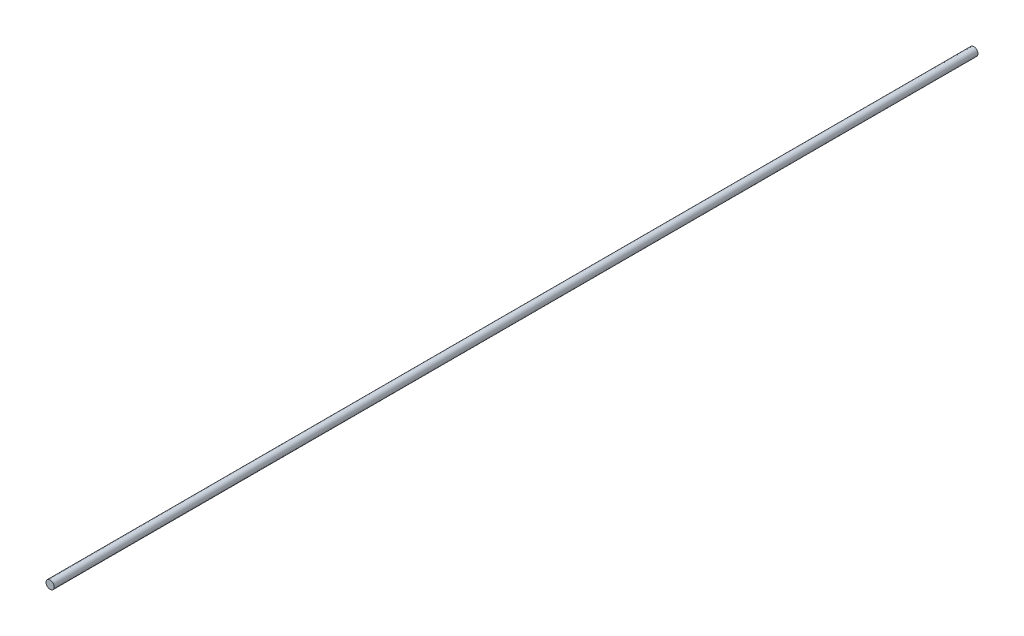
ISO-10303-21;
HEADER;
FILE_DESCRIPTION(('STEP AP214'),'2;1');
FILE_NAME('part.step','',(''),(''),'','','');
FILE_SCHEMA(('AUTOMOTIVE_DESIGN { 1 0 10303 214 1 1 1 1 }'));
ENDSEC;
DATA;
#1=APPLICATION_CONTEXT('core data for automotive mechanical design processes');
#2=APPLICATION_PROTOCOL_DEFINITION('international standard','automotive_design',2000,#1);
#3=PRODUCT_CONTEXT('',#1,'mechanical');
#4=PRODUCT('Part','Part','',(#3));
#5=PRODUCT_RELATED_PRODUCT_CATEGORY('part','',(#4));
#6=PRODUCT_DEFINITION_FORMATION('','',#4);
#7=PRODUCT_DEFINITION_CONTEXT('part definition',#1,'design');
#8=PRODUCT_DEFINITION('design','',#6,#7);
#9=PRODUCT_DEFINITION_SHAPE('','',#8);
#10=(LENGTH_UNIT() NAMED_UNIT(*) SI_UNIT(.MILLI.,.METRE.));
#11=(NAMED_UNIT(*) PLANE_ANGLE_UNIT() SI_UNIT($,.RADIAN.));
#12=(NAMED_UNIT(*) SI_UNIT($,.STERADIAN.) SOLID_ANGLE_UNIT());
#13=UNCERTAINTY_MEASURE_WITH_UNIT(LENGTH_MEASURE(1.E-05),#10,'distance_accuracy_value','');
#14=(GEOMETRIC_REPRESENTATION_CONTEXT(3) GLOBAL_UNCERTAINTY_ASSIGNED_CONTEXT((#13)) GLOBAL_UNIT_ASSIGNED_CONTEXT((#10,
#11,#12)) REPRESENTATION_CONTEXT('',''));
#15=CARTESIAN_POINT('',(0.,0.,0.));
#16=DIRECTION('',(0.,0.,1.));
#17=DIRECTION('',(1.,0.,0.));
#18=AXIS2_PLACEMENT_3D('',#15,#16,#17);
#19=CARTESIAN_POINT('',(0.,0.,900.));
#20=DIRECTION('',(0.,0.,-1.));
#21=DIRECTION('',(-1.,0.,0.));
#22=AXIS2_PLACEMENT_3D('',#19,#20,#21);
#23=CYLINDRICAL_SURFACE('',#22,4.);
#24=CARTESIAN_POINT('',(0.,0.,20.5301616193284));
#25=DIRECTION('',(0.,0.,1.));
#26=DIRECTION('',(1.,0.,0.));
#27=AXIS2_PLACEMENT_3D('',#24,#25,#26);
#28=CIRCLE('',#27,4.);
#29=CARTESIAN_POINT('',(-1.93649167310371,-3.5,20.5301616193283));
#30=VERTEX_POINT('',#29);
#31=CARTESIAN_POINT('',(1.93649167310371,-3.5,20.5301616193284));
#32=VERTEX_POINT('',#31);
#33=EDGE_CURVE('E293',#30,#32,#28,.T.);
#34=ORIENTED_EDGE('',*,*,#33,.T.);
#35=DIRECTION('',(0.,0.,-1.));
#36=VECTOR('',#35,1.);
#37=CARTESIAN_POINT('',(1.93649167310371,-3.5,900.));
#38=LINE('',#37,#36);
#39=CARTESIAN_POINT('',(1.93649167310371,-3.5,3.45840405573401));
#40=VERTEX_POINT('',#39);
#41=EDGE_CURVE('E11',#32,#40,#38,.T.);
#42=ORIENTED_EDGE('',*,*,#41,.T.);
#43=CARTESIAN_POINT('',(0.,0.,3.45840405573405));
#44=DIRECTION('',(0.,0.,-1.));
#45=DIRECTION('',(-1.,0.,0.));
#46=AXIS2_PLACEMENT_3D('',#43,#44,#45);
#47=CIRCLE('',#46,4.);
#48=CARTESIAN_POINT('',(-1.93649167310371,-3.5,3.45840405573401));
#49=VERTEX_POINT('',#48);
#50=EDGE_CURVE('E40',#40,#49,#47,.T.);
#51=ORIENTED_EDGE('',*,*,#50,.T.);
#52=DIRECTION('',(0.,0.,-1.));
#53=VECTOR('',#52,1.);
#54=CARTESIAN_POINT('',(-1.93649167310371,-3.5,900.));
#55=LINE('',#54,#53);
#56=EDGE_CURVE('E290',#49,#30,#55,.F.);
#57=ORIENTED_EDGE('',*,*,#56,.T.);
#58=EDGE_LOOP('',(#34,#42,#51,#57));
#59=FACE_BOUND('',#58,.T.);
#60=CARTESIAN_POINT('',(0.,0.,110.530161619328));
#61=DIRECTION('',(0.,0.,1.));
#62=DIRECTION('',(1.,0.,0.));
#63=AXIS2_PLACEMENT_3D('',#60,#61,#62);
#64=CIRCLE('',#63,4.);
#65=CARTESIAN_POINT('',(-1.93649167310371,-3.5,110.530161619328));
#66=VERTEX_POINT('',#65);
#67=CARTESIAN_POINT('',(1.93649167310371,-3.5,110.530161619328));
#68=VERTEX_POINT('',#67);
#69=EDGE_CURVE('E281',#66,#68,#64,.T.);
#70=ORIENTED_EDGE('',*,*,#69,.T.);
#71=DIRECTION('',(0.,0.,-1.));
#72=VECTOR('',#71,1.);
#73=CARTESIAN_POINT('',(1.93649167310371,-3.5,900.));
#74=LINE('',#73,#72);
#75=CARTESIAN_POINT('',(1.93649167310371,-3.5,93.458404055734));
#76=VERTEX_POINT('',#75);
#77=EDGE_CURVE('E287',#68,#76,#74,.T.);
#78=ORIENTED_EDGE('',*,*,#77,.T.);
#79=CARTESIAN_POINT('',(0.,0.,93.458404055734));
#80=DIRECTION('',(0.,0.,-1.));
#81=DIRECTION('',(-1.,0.,0.));
#82=AXIS2_PLACEMENT_3D('',#79,#80,#81);
#83=CIRCLE('',#82,4.);
#84=CARTESIAN_POINT('',(-1.93649167310371,-3.5,93.458404055734));
#85=VERTEX_POINT('',#84);
#86=EDGE_CURVE('E284',#76,#85,#83,.T.);
#87=ORIENTED_EDGE('',*,*,#86,.T.);
#88=DIRECTION('',(0.,0.,-1.));
#89=VECTOR('',#88,1.);
#90=CARTESIAN_POINT('',(-1.93649167310371,-3.5,900.));
#91=LINE('',#90,#89);
#92=EDGE_CURVE('E278',#85,#66,#91,.F.);
#93=ORIENTED_EDGE('',*,*,#92,.T.);
#94=EDGE_LOOP('',(#70,#78,#87,#93));
#95=FACE_BOUND('',#94,.T.);
#96=CARTESIAN_POINT('',(0.,0.,200.530161619328));
#97=DIRECTION('',(0.,0.,1.));
#98=DIRECTION('',(1.,0.,0.));
#99=AXIS2_PLACEMENT_3D('',#96,#97,#98);
#100=CIRCLE('',#99,4.);
#101=CARTESIAN_POINT('',(-1.93649167310371,-3.5,200.530161619328));
#102=VERTEX_POINT('',#101);
#103=CARTESIAN_POINT('',(1.93649167310371,-3.5,200.530161619328));
#104=VERTEX_POINT('',#103);
#105=EDGE_CURVE('E269',#102,#104,#100,.T.);
#106=ORIENTED_EDGE('',*,*,#105,.T.);
#107=DIRECTION('',(0.,0.,-1.));
#108=VECTOR('',#107,1.);
#109=CARTESIAN_POINT('',(1.93649167310371,-3.5,900.));
#110=LINE('',#109,#108);
#111=CARTESIAN_POINT('',(1.93649167310371,-3.5,183.458404055734));
#112=VERTEX_POINT('',#111);
#113=EDGE_CURVE('E275',#104,#112,#110,.T.);
#114=ORIENTED_EDGE('',*,*,#113,.T.);
#115=CARTESIAN_POINT('',(0.,0.,183.458404055734));
#116=DIRECTION('',(0.,0.,-1.));
#117=DIRECTION('',(-1.,0.,0.));
#118=AXIS2_PLACEMENT_3D('',#115,#116,#117);
#119=CIRCLE('',#118,4.);
#120=CARTESIAN_POINT('',(-1.93649167310371,-3.5,183.458404055734));
#121=VERTEX_POINT('',#120);
#122=EDGE_CURVE('E272',#112,#121,#119,.T.);
#123=ORIENTED_EDGE('',*,*,#122,.T.);
#124=DIRECTION('',(0.,0.,-1.));
#125=VECTOR('',#124,1.);
#126=CARTESIAN_POINT('',(-1.93649167310371,-3.5,900.));
#127=LINE('',#126,#125);
#128=EDGE_CURVE('E266',#121,#102,#127,.F.);
#129=ORIENTED_EDGE('',*,*,#128,.T.);
#130=EDGE_LOOP('',(#106,#114,#123,#129));
#131=FACE_BOUND('',#130,.T.);
#132=CARTESIAN_POINT('',(0.,0.,290.530161619328));
#133=DIRECTION('',(0.,0.,1.));
#134=DIRECTION('',(1.,0.,0.));
#135=AXIS2_PLACEMENT_3D('',#132,#133,#134);
#136=CIRCLE('',#135,4.);
#137=CARTESIAN_POINT('',(-1.93649167310371,-3.5,290.530161619328));
#138=VERTEX_POINT('',#137);
#139=CARTESIAN_POINT('',(1.93649167310371,-3.5,290.530161619328));
#140=VERTEX_POINT('',#139);
#141=EDGE_CURVE('E257',#138,#140,#136,.T.);
#142=ORIENTED_EDGE('',*,*,#141,.T.);
#143=DIRECTION('',(0.,0.,-1.));
#144=VECTOR('',#143,1.);
#145=CARTESIAN_POINT('',(1.93649167310371,-3.5,900.));
#146=LINE('',#145,#144);
#147=CARTESIAN_POINT('',(1.93649167310371,-3.5,273.458404055734));
#148=VERTEX_POINT('',#147);
#149=EDGE_CURVE('E263',#140,#148,#146,.T.);
#150=ORIENTED_EDGE('',*,*,#149,.T.);
#151=CARTESIAN_POINT('',(0.,0.,273.458404055734));
#152=DIRECTION('',(0.,0.,-1.));
#153=DIRECTION('',(-1.,0.,0.));
#154=AXIS2_PLACEMENT_3D('',#151,#152,#153);
#155=CIRCLE('',#154,4.);
#156=CARTESIAN_POINT('',(-1.93649167310371,-3.5,273.458404055734));
#157=VERTEX_POINT('',#156);
#158=EDGE_CURVE('E260',#148,#157,#155,.T.);
#159=ORIENTED_EDGE('',*,*,#158,.T.);
#160=DIRECTION('',(0.,0.,-1.));
#161=VECTOR('',#160,1.);
#162=CARTESIAN_POINT('',(-1.93649167310371,-3.5,900.));
#163=LINE('',#162,#161);
#164=EDGE_CURVE('E254',#157,#138,#163,.F.);
#165=ORIENTED_EDGE('',*,*,#164,.T.);
#166=EDGE_LOOP('',(#142,#150,#159,#165));
#167=FACE_BOUND('',#166,.T.);
#168=CARTESIAN_POINT('',(0.,0.,380.530161619328));
#169=DIRECTION('',(0.,0.,1.));
#170=DIRECTION('',(1.,0.,0.));
#171=AXIS2_PLACEMENT_3D('',#168,#169,#170);
#172=CIRCLE('',#171,4.);
#173=CARTESIAN_POINT('',(-1.93649167310371,-3.5,380.530161619328));
#174=VERTEX_POINT('',#173);
#175=CARTESIAN_POINT('',(1.93649167310371,-3.5,380.530161619328));
#176=VERTEX_POINT('',#175);
#177=EDGE_CURVE('E245',#174,#176,#172,.T.);
#178=ORIENTED_EDGE('',*,*,#177,.T.);
#179=DIRECTION('',(0.,0.,-1.));
#180=VECTOR('',#179,1.);
#181=CARTESIAN_POINT('',(1.93649167310371,-3.5,900.));
#182=LINE('',#181,#180);
#183=CARTESIAN_POINT('',(1.93649167310371,-3.5,363.458404055734));
#184=VERTEX_POINT('',#183);
#185=EDGE_CURVE('E251',#176,#184,#182,.T.);
#186=ORIENTED_EDGE('',*,*,#185,.T.);
#187=CARTESIAN_POINT('',(0.,0.,363.458404055734));
#188=DIRECTION('',(0.,0.,-1.));
#189=DIRECTION('',(-1.,0.,0.));
#190=AXIS2_PLACEMENT_3D('',#187,#188,#189);
#191=CIRCLE('',#190,4.);
#192=CARTESIAN_POINT('',(-1.93649167310371,-3.5,363.458404055734));
#193=VERTEX_POINT('',#192);
#194=EDGE_CURVE('E248',#184,#193,#191,.T.);
#195=ORIENTED_EDGE('',*,*,#194,.T.);
#196=DIRECTION('',(0.,0.,-1.));
#197=VECTOR('',#196,1.);
#198=CARTESIAN_POINT('',(-1.93649167310371,-3.5,900.));
#199=LINE('',#198,#197);
#200=EDGE_CURVE('E242',#193,#174,#199,.F.);
#201=ORIENTED_EDGE('',*,*,#200,.T.);
#202=EDGE_LOOP('',(#178,#186,#195,#201));
#203=FACE_BOUND('',#202,.T.);
#204=CARTESIAN_POINT('',(0.,0.,470.530161619328));
#205=DIRECTION('',(0.,0.,1.));
#206=DIRECTION('',(1.,0.,0.));
#207=AXIS2_PLACEMENT_3D('',#204,#205,#206);
#208=CIRCLE('',#207,4.);
#209=CARTESIAN_POINT('',(-1.93649167310371,-3.5,470.530161619328));
#210=VERTEX_POINT('',#209);
#211=CARTESIAN_POINT('',(1.93649167310371,-3.5,470.530161619328));
#212=VERTEX_POINT('',#211);
#213=EDGE_CURVE('E233',#210,#212,#208,.T.);
#214=ORIENTED_EDGE('',*,*,#213,.T.);
#215=DIRECTION('',(0.,0.,-1.));
#216=VECTOR('',#215,1.);
#217=CARTESIAN_POINT('',(1.93649167310371,-3.5,900.));
#218=LINE('',#217,#216);
#219=CARTESIAN_POINT('',(1.93649167310371,-3.5,453.458404055734));
#220=VERTEX_POINT('',#219);
#221=EDGE_CURVE('E239',#212,#220,#218,.T.);
#222=ORIENTED_EDGE('',*,*,#221,.T.);
#223=CARTESIAN_POINT('',(0.,0.,453.458404055734));
#224=DIRECTION('',(0.,0.,-1.));
#225=DIRECTION('',(-1.,0.,0.));
#226=AXIS2_PLACEMENT_3D('',#223,#224,#225);
#227=CIRCLE('',#226,4.);
#228=CARTESIAN_POINT('',(-1.93649167310371,-3.5,453.458404055734));
#229=VERTEX_POINT('',#228);
#230=EDGE_CURVE('E236',#220,#229,#227,.T.);
#231=ORIENTED_EDGE('',*,*,#230,.T.);
#232=DIRECTION('',(0.,0.,-1.));
#233=VECTOR('',#232,1.);
#234=CARTESIAN_POINT('',(-1.93649167310371,-3.5,900.));
#235=LINE('',#234,#233);
#236=EDGE_CURVE('E230',#229,#210,#235,.F.);
#237=ORIENTED_EDGE('',*,*,#236,.T.);
#238=EDGE_LOOP('',(#214,#222,#231,#237));
#239=FACE_BOUND('',#238,.T.);
#240=CARTESIAN_POINT('',(0.,0.,560.530161619328));
#241=DIRECTION('',(0.,0.,1.));
#242=DIRECTION('',(1.,0.,0.));
#243=AXIS2_PLACEMENT_3D('',#240,#241,#242);
#244=CIRCLE('',#243,4.);
#245=CARTESIAN_POINT('',(-1.93649167310371,-3.5,560.530161619328));
#246=VERTEX_POINT('',#245);
#247=CARTESIAN_POINT('',(1.93649167310371,-3.5,560.530161619328));
#248=VERTEX_POINT('',#247);
#249=EDGE_CURVE('E221',#246,#248,#244,.T.);
#250=ORIENTED_EDGE('',*,*,#249,.T.);
#251=DIRECTION('',(0.,0.,-1.));
#252=VECTOR('',#251,1.);
#253=CARTESIAN_POINT('',(1.93649167310371,-3.5,900.));
#254=LINE('',#253,#252);
#255=CARTESIAN_POINT('',(1.93649167310371,-3.5,543.458404055734));
#256=VERTEX_POINT('',#255);
#257=EDGE_CURVE('E227',#248,#256,#254,.T.);
#258=ORIENTED_EDGE('',*,*,#257,.T.);
#259=CARTESIAN_POINT('',(0.,0.,543.458404055734));
#260=DIRECTION('',(0.,0.,-1.));
#261=DIRECTION('',(-1.,0.,0.));
#262=AXIS2_PLACEMENT_3D('',#259,#260,#261);
#263=CIRCLE('',#262,4.);
#264=CARTESIAN_POINT('',(-1.93649167310371,-3.5,543.458404055734));
#265=VERTEX_POINT('',#264);
#266=EDGE_CURVE('E224',#256,#265,#263,.T.);
#267=ORIENTED_EDGE('',*,*,#266,.T.);
#268=DIRECTION('',(0.,0.,-1.));
#269=VECTOR('',#268,1.);
#270=CARTESIAN_POINT('',(-1.93649167310371,-3.5,900.));
#271=LINE('',#270,#269);
#272=EDGE_CURVE('E218',#265,#246,#271,.F.);
#273=ORIENTED_EDGE('',*,*,#272,.T.);
#274=EDGE_LOOP('',(#250,#258,#267,#273));
#275=FACE_BOUND('',#274,.T.);
#276=CARTESIAN_POINT('',(0.,0.,650.530161619328));
#277=DIRECTION('',(0.,0.,1.));
#278=DIRECTION('',(1.,0.,0.));
#279=AXIS2_PLACEMENT_3D('',#276,#277,#278);
#280=CIRCLE('',#279,4.);
#281=CARTESIAN_POINT('',(-1.93649167310371,-3.5,650.530161619328));
#282=VERTEX_POINT('',#281);
#283=CARTESIAN_POINT('',(1.93649167310371,-3.5,650.530161619328));
#284=VERTEX_POINT('',#283);
#285=EDGE_CURVE('E209',#282,#284,#280,.T.);
#286=ORIENTED_EDGE('',*,*,#285,.T.);
#287=DIRECTION('',(0.,0.,-1.));
#288=VECTOR('',#287,1.);
#289=CARTESIAN_POINT('',(1.93649167310371,-3.5,900.));
#290=LINE('',#289,#288);
#291=CARTESIAN_POINT('',(1.93649167310371,-3.5,633.458404055734));
#292=VERTEX_POINT('',#291);
#293=EDGE_CURVE('E215',#284,#292,#290,.T.);
#294=ORIENTED_EDGE('',*,*,#293,.T.);
#295=CARTESIAN_POINT('',(0.,0.,633.458404055734));
#296=DIRECTION('',(0.,0.,-1.));
#297=DIRECTION('',(-1.,0.,0.));
#298=AXIS2_PLACEMENT_3D('',#295,#296,#297);
#299=CIRCLE('',#298,4.);
#300=CARTESIAN_POINT('',(-1.93649167310371,-3.5,633.458404055734));
#301=VERTEX_POINT('',#300);
#302=EDGE_CURVE('E212',#292,#301,#299,.T.);
#303=ORIENTED_EDGE('',*,*,#302,.T.);
#304=DIRECTION('',(0.,0.,-1.));
#305=VECTOR('',#304,1.);
#306=CARTESIAN_POINT('',(-1.93649167310371,-3.5,900.));
#307=LINE('',#306,#305);
#308=EDGE_CURVE('E206',#301,#282,#307,.F.);
#309=ORIENTED_EDGE('',*,*,#308,.T.);
#310=EDGE_LOOP('',(#286,#294,#303,#309));
#311=FACE_BOUND('',#310,.T.);
#312=CARTESIAN_POINT('',(0.,0.,740.530161619328));
#313=DIRECTION('',(0.,0.,1.));
#314=DIRECTION('',(1.,0.,0.));
#315=AXIS2_PLACEMENT_3D('',#312,#313,#314);
#316=CIRCLE('',#315,4.);
#317=CARTESIAN_POINT('',(-1.93649167310371,-3.5,740.530161619328));
#318=VERTEX_POINT('',#317);
#319=CARTESIAN_POINT('',(1.93649167310371,-3.5,740.530161619328));
#320=VERTEX_POINT('',#319);
#321=EDGE_CURVE('E197',#318,#320,#316,.T.);
#322=ORIENTED_EDGE('',*,*,#321,.T.);
#323=DIRECTION('',(0.,0.,-1.));
#324=VECTOR('',#323,1.);
#325=CARTESIAN_POINT('',(1.93649167310371,-3.5,900.));
#326=LINE('',#325,#324);
#327=CARTESIAN_POINT('',(1.93649167310371,-3.5,723.458404055734));
#328=VERTEX_POINT('',#327);
#329=EDGE_CURVE('E203',#320,#328,#326,.T.);
#330=ORIENTED_EDGE('',*,*,#329,.T.);
#331=CARTESIAN_POINT('',(0.,0.,723.458404055734));
#332=DIRECTION('',(0.,0.,-1.));
#333=DIRECTION('',(-1.,0.,0.));
#334=AXIS2_PLACEMENT_3D('',#331,#332,#333);
#335=CIRCLE('',#334,4.);
#336=CARTESIAN_POINT('',(-1.93649167310371,-3.5,723.458404055734));
#337=VERTEX_POINT('',#336);
#338=EDGE_CURVE('E200',#328,#337,#335,.T.);
#339=ORIENTED_EDGE('',*,*,#338,.T.);
#340=DIRECTION('',(0.,0.,-1.));
#341=VECTOR('',#340,1.);
#342=CARTESIAN_POINT('',(-1.93649167310371,-3.5,900.));
#343=LINE('',#342,#341);
#344=EDGE_CURVE('E179',#337,#318,#343,.F.);
#345=ORIENTED_EDGE('',*,*,#344,.T.);
#346=EDGE_LOOP('',(#322,#330,#339,#345));
#347=FACE_BOUND('',#346,.T.);
#348=CARTESIAN_POINT('',(0.,0.,830.530161619328));
#349=DIRECTION('',(0.,0.,1.));
#350=DIRECTION('',(1.,0.,0.));
#351=AXIS2_PLACEMENT_3D('',#348,#349,#350);
#352=CIRCLE('',#351,4.);
#353=CARTESIAN_POINT('',(-1.93649167310371,-3.5,830.530161619328));
#354=VERTEX_POINT('',#353);
#355=CARTESIAN_POINT('',(1.93649167310371,-3.5,830.530161619328));
#356=VERTEX_POINT('',#355);
#357=EDGE_CURVE('E184',#354,#356,#352,.T.);
#358=ORIENTED_EDGE('',*,*,#357,.T.);
#359=DIRECTION('',(0.,0.,-1.));
#360=VECTOR('',#359,1.);
#361=CARTESIAN_POINT('',(1.93649167310371,-3.5,900.));
#362=LINE('',#361,#360);
#363=CARTESIAN_POINT('',(1.93649167310371,-3.5,813.458404055734));
#364=VERTEX_POINT('',#363);
#365=EDGE_CURVE('E169',#356,#364,#362,.T.);
#366=ORIENTED_EDGE('',*,*,#365,.T.);
#367=CARTESIAN_POINT('',(0.,0.,813.458404055734));
#368=DIRECTION('',(0.,0.,-1.));
#369=DIRECTION('',(-1.,0.,0.));
#370=AXIS2_PLACEMENT_3D('',#367,#368,#369);
#371=CIRCLE('',#370,4.);
#372=CARTESIAN_POINT('',(-1.93649167310371,-3.5,813.458404055734));
#373=VERTEX_POINT('',#372);
#374=EDGE_CURVE('E180',#364,#373,#371,.T.);
#375=ORIENTED_EDGE('',*,*,#374,.T.);
#376=DIRECTION('',(0.,0.,-1.));
#377=VECTOR('',#376,1.);
#378=CARTESIAN_POINT('',(-1.93649167310371,-3.5,900.));
#379=LINE('',#378,#377);
#380=EDGE_CURVE('E188',#373,#354,#379,.F.);
#381=ORIENTED_EDGE('',*,*,#380,.T.);
#382=EDGE_LOOP('',(#358,#366,#375,#381));
#383=FACE_BOUND('',#382,.T.);
#384=CARTESIAN_POINT('',(0.,0.,900.));
#385=DIRECTION('',(0.,0.,1.));
#386=DIRECTION('',(1.,0.,0.));
#387=AXIS2_PLACEMENT_3D('',#384,#385,#386);
#388=CIRCLE('',#387,4.);
#389=CARTESIAN_POINT('',(4.,0.,900.));
#390=VERTEX_POINT('',#389);
#391=EDGE_CURVE('E191',#390,#390,#388,.T.);
#392=ORIENTED_EDGE('',*,*,#391,.F.);
#393=EDGE_LOOP('',(#392));
#394=FACE_BOUND('',#393,.T.);
#395=CARTESIAN_POINT('',(0.,0.,0.));
#396=DIRECTION('',(0.,0.,1.));
#397=DIRECTION('',(1.,0.,0.));
#398=AXIS2_PLACEMENT_3D('',#395,#396,#397);
#399=CIRCLE('',#398,4.);
#400=CARTESIAN_POINT('',(4.,0.,0.));
#401=VERTEX_POINT('',#400);
#402=EDGE_CURVE('E304',#401,#401,#399,.T.);
#403=ORIENTED_EDGE('',*,*,#402,.T.);
#404=EDGE_LOOP('',(#403));
#405=FACE_BOUND('',#404,.T.);
#406=ADVANCED_FACE('F33',(#59,#95,#131,#167,#203,#239,#275,#311,#347,#383,#394,#405),#23,.T.);
#407=CARTESIAN_POINT('',(0.,0.,900.));
#408=DIRECTION('',(0.,0.,1.));
#409=DIRECTION('',(1.,0.,0.));
#410=AXIS2_PLACEMENT_3D('',#407,#408,#409);
#411=PLANE('',#410);
#412=ORIENTED_EDGE('',*,*,#391,.T.);
#413=EDGE_LOOP('',(#412));
#414=FACE_BOUND('',#413,.T.);
#415=ADVANCED_FACE('F359',(#414),#411,.T.);
#416=CARTESIAN_POINT('',(0.,0.,0.));
#417=DIRECTION('',(0.,0.,1.));
#418=DIRECTION('',(1.,0.,0.));
#419=AXIS2_PLACEMENT_3D('',#416,#417,#418);
#420=PLANE('',#419);
#421=ORIENTED_EDGE('',*,*,#402,.F.);
#422=EDGE_LOOP('',(#421));
#423=FACE_BOUND('',#422,.T.);
#424=ADVANCED_FACE('F364',(#423),#420,.F.);
#425=CARTESIAN_POINT('',(-2.71325807098481,-13.5,813.458404055734));
#426=DIRECTION('',(0.,0.,-1.));
#427=DIRECTION('',(-1.,0.,0.));
#428=AXIS2_PLACEMENT_3D('',#425,#426,#427);
#429=PLANE('',#428);
#430=DIRECTION('',(-1.,0.,0.));
#431=VECTOR('',#430,1.);
#432=CARTESIAN_POINT('',(-2.71325807098481,-3.5,813.458404055734));
#433=LINE('',#432,#431);
#434=EDGE_CURVE('E175',#364,#373,#433,.T.);
#435=ORIENTED_EDGE('',*,*,#434,.T.);
#436=ORIENTED_EDGE('',*,*,#374,.F.);
#437=EDGE_LOOP('',(#435,#436));
#438=FACE_BOUND('',#437,.T.);
#439=ADVANCED_FACE('F366',(#438),#429,.F.);
#440=CARTESIAN_POINT('',(-2.71325807098481,-13.5,830.530161619328));
#441=DIRECTION('',(0.,0.,1.));
#442=DIRECTION('',(1.,0.,0.));
#443=AXIS2_PLACEMENT_3D('',#440,#441,#442);
#444=PLANE('',#443);
#445=DIRECTION('',(1.,0.,0.));
#446=VECTOR('',#445,1.);
#447=CARTESIAN_POINT('',(-2.71325807098481,-3.5,830.530161619328));
#448=LINE('',#447,#446);
#449=EDGE_CURVE('E172',#354,#356,#448,.T.);
#450=ORIENTED_EDGE('',*,*,#449,.T.);
#451=ORIENTED_EDGE('',*,*,#357,.F.);
#452=EDGE_LOOP('',(#450,#451));
#453=FACE_BOUND('',#452,.T.);
#454=ADVANCED_FACE('F183',(#453),#444,.F.);
#455=CARTESIAN_POINT('',(0.,-3.5,0.));
#456=DIRECTION('',(0.,1.,0.));
#457=DIRECTION('',(0.,0.,1.));
#458=AXIS2_PLACEMENT_3D('',#455,#456,#457);
#459=PLANE('',#458);
#460=ORIENTED_EDGE('',*,*,#449,.F.);
#461=ORIENTED_EDGE('',*,*,#380,.F.);
#462=ORIENTED_EDGE('',*,*,#434,.F.);
#463=ORIENTED_EDGE('',*,*,#365,.F.);
#464=EDGE_LOOP('',(#460,#461,#462,#463));
#465=FACE_BOUND('',#464,.T.);
#466=ADVANCED_FACE('F171',(#465),#459,.F.);
#467=CARTESIAN_POINT('',(-2.71325807098575,-13.5,723.458404055734));
#468=DIRECTION('',(0.,0.,-1.));
#469=DIRECTION('',(-1.,0.,0.));
#470=AXIS2_PLACEMENT_3D('',#467,#468,#469);
#471=PLANE('',#470);
#472=DIRECTION('',(-1.,0.,0.));
#473=VECTOR('',#472,1.);
#474=CARTESIAN_POINT('',(-2.71325807098575,-3.5,723.458404055734));
#475=LINE('',#474,#473);
#476=EDGE_CURVE('E347',#328,#337,#475,.T.);
#477=ORIENTED_EDGE('',*,*,#476,.T.);
#478=ORIENTED_EDGE('',*,*,#338,.F.);
#479=EDGE_LOOP('',(#477,#478));
#480=FACE_BOUND('',#479,.T.);
#481=ADVANCED_FACE('F379',(#480),#471,.F.);
#482=CARTESIAN_POINT('',(-2.71325807098575,-13.5,740.530161619328));
#483=DIRECTION('',(0.,0.,1.));
#484=DIRECTION('',(1.,0.,0.));
#485=AXIS2_PLACEMENT_3D('',#482,#483,#484);
#486=PLANE('',#485);
#487=DIRECTION('',(1.,0.,0.));
#488=VECTOR('',#487,1.);
#489=CARTESIAN_POINT('',(-2.71325807098575,-3.5,740.530161619328));
#490=LINE('',#489,#488);
#491=EDGE_CURVE('E350',#318,#320,#490,.T.);
#492=ORIENTED_EDGE('',*,*,#491,.T.);
#493=ORIENTED_EDGE('',*,*,#321,.F.);
#494=EDGE_LOOP('',(#492,#493));
#495=FACE_BOUND('',#494,.T.);
#496=ADVANCED_FACE('F380',(#495),#486,.F.);
#497=CARTESIAN_POINT('',(0.,-3.5,0.));
#498=DIRECTION('',(0.,1.,0.));
#499=DIRECTION('',(0.,0.,1.));
#500=AXIS2_PLACEMENT_3D('',#497,#498,#499);
#501=PLANE('',#500);
#502=ORIENTED_EDGE('',*,*,#491,.F.);
#503=ORIENTED_EDGE('',*,*,#344,.F.);
#504=ORIENTED_EDGE('',*,*,#476,.F.);
#505=ORIENTED_EDGE('',*,*,#329,.F.);
#506=EDGE_LOOP('',(#502,#503,#504,#505));
#507=FACE_BOUND('',#506,.T.);
#508=ADVANCED_FACE('F383',(#507),#501,.F.);
#509=CARTESIAN_POINT('',(-2.71325807098669,-13.5,633.458404055734));
#510=DIRECTION('',(0.,0.,-1.));
#511=DIRECTION('',(-1.,0.,0.));
#512=AXIS2_PLACEMENT_3D('',#509,#510,#511);
#513=PLANE('',#512);
#514=DIRECTION('',(-1.,0.,0.));
#515=VECTOR('',#514,1.);
#516=CARTESIAN_POINT('',(-2.71325807098669,-3.5,633.458404055734));
#517=LINE('',#516,#515);
#518=EDGE_CURVE('E341',#292,#301,#517,.T.);
#519=ORIENTED_EDGE('',*,*,#518,.T.);
#520=ORIENTED_EDGE('',*,*,#302,.F.);
#521=EDGE_LOOP('',(#519,#520));
#522=FACE_BOUND('',#521,.T.);
#523=ADVANCED_FACE('F390',(#522),#513,.F.);
#524=CARTESIAN_POINT('',(-2.71325807098669,-13.5,650.530161619328));
#525=DIRECTION('',(0.,0.,1.));
#526=DIRECTION('',(1.,0.,0.));
#527=AXIS2_PLACEMENT_3D('',#524,#525,#526);
#528=PLANE('',#527);
#529=DIRECTION('',(1.,0.,0.));
#530=VECTOR('',#529,1.);
#531=CARTESIAN_POINT('',(-2.71325807098669,-3.5,650.530161619328));
#532=LINE('',#531,#530);
#533=EDGE_CURVE('E344',#282,#284,#532,.T.);
#534=ORIENTED_EDGE('',*,*,#533,.T.);
#535=ORIENTED_EDGE('',*,*,#285,.F.);
#536=EDGE_LOOP('',(#534,#535));
#537=FACE_BOUND('',#536,.T.);
#538=ADVANCED_FACE('F392',(#537),#528,.F.);
#539=CARTESIAN_POINT('',(0.,-3.5,0.));
#540=DIRECTION('',(0.,1.,0.));
#541=DIRECTION('',(0.,0.,1.));
#542=AXIS2_PLACEMENT_3D('',#539,#540,#541);
#543=PLANE('',#542);
#544=ORIENTED_EDGE('',*,*,#533,.F.);
#545=ORIENTED_EDGE('',*,*,#308,.F.);
#546=ORIENTED_EDGE('',*,*,#518,.F.);
#547=ORIENTED_EDGE('',*,*,#293,.F.);
#548=EDGE_LOOP('',(#544,#545,#546,#547));
#549=FACE_BOUND('',#548,.T.);
#550=ADVANCED_FACE('F395',(#549),#543,.F.);
#551=CARTESIAN_POINT('',(-2.71325807098763,-13.5,543.458404055734));
#552=DIRECTION('',(0.,0.,-1.));
#553=DIRECTION('',(-1.,0.,0.));
#554=AXIS2_PLACEMENT_3D('',#551,#552,#553);
#555=PLANE('',#554);
#556=DIRECTION('',(-1.,0.,0.));
#557=VECTOR('',#556,1.);
#558=CARTESIAN_POINT('',(-2.71325807098763,-3.5,543.458404055734));
#559=LINE('',#558,#557);
#560=EDGE_CURVE('E335',#256,#265,#559,.T.);
#561=ORIENTED_EDGE('',*,*,#560,.T.);
#562=ORIENTED_EDGE('',*,*,#266,.F.);
#563=EDGE_LOOP('',(#561,#562));
#564=FACE_BOUND('',#563,.T.);
#565=ADVANCED_FACE('F402',(#564),#555,.F.);
#566=CARTESIAN_POINT('',(-2.71325807098763,-13.5,560.530161619328));
#567=DIRECTION('',(0.,0.,1.));
#568=DIRECTION('',(1.,0.,0.));
#569=AXIS2_PLACEMENT_3D('',#566,#567,#568);
#570=PLANE('',#569);
#571=DIRECTION('',(1.,0.,0.));
#572=VECTOR('',#571,1.);
#573=CARTESIAN_POINT('',(-2.71325807098763,-3.5,560.530161619328));
#574=LINE('',#573,#572);
#575=EDGE_CURVE('E338',#246,#248,#574,.T.);
#576=ORIENTED_EDGE('',*,*,#575,.T.);
#577=ORIENTED_EDGE('',*,*,#249,.F.);
#578=EDGE_LOOP('',(#576,#577));
#579=FACE_BOUND('',#578,.T.);
#580=ADVANCED_FACE('F404',(#579),#570,.F.);
#581=CARTESIAN_POINT('',(0.,-3.5,0.));
#582=DIRECTION('',(0.,1.,0.));
#583=DIRECTION('',(0.,0.,1.));
#584=AXIS2_PLACEMENT_3D('',#581,#582,#583);
#585=PLANE('',#584);
#586=ORIENTED_EDGE('',*,*,#575,.F.);
#587=ORIENTED_EDGE('',*,*,#272,.F.);
#588=ORIENTED_EDGE('',*,*,#560,.F.);
#589=ORIENTED_EDGE('',*,*,#257,.F.);
#590=EDGE_LOOP('',(#586,#587,#588,#589));
#591=FACE_BOUND('',#590,.T.);
#592=ADVANCED_FACE('F407',(#591),#585,.F.);
#593=CARTESIAN_POINT('',(-2.71325807098858,-13.5,453.458404055734));
#594=DIRECTION('',(0.,0.,-1.));
#595=DIRECTION('',(-1.,0.,0.));
#596=AXIS2_PLACEMENT_3D('',#593,#594,#595);
#597=PLANE('',#596);
#598=DIRECTION('',(-1.,0.,0.));
#599=VECTOR('',#598,1.);
#600=CARTESIAN_POINT('',(-2.71325807098858,-3.5,453.458404055734));
#601=LINE('',#600,#599);
#602=EDGE_CURVE('E329',#220,#229,#601,.T.);
#603=ORIENTED_EDGE('',*,*,#602,.T.);
#604=ORIENTED_EDGE('',*,*,#230,.F.);
#605=EDGE_LOOP('',(#603,#604));
#606=FACE_BOUND('',#605,.T.);
#607=ADVANCED_FACE('F414',(#606),#597,.F.);
#608=CARTESIAN_POINT('',(-2.71325807098858,-13.5,470.530161619328));
#609=DIRECTION('',(0.,0.,1.));
#610=DIRECTION('',(1.,0.,0.));
#611=AXIS2_PLACEMENT_3D('',#608,#609,#610);
#612=PLANE('',#611);
#613=DIRECTION('',(1.,0.,0.));
#614=VECTOR('',#613,1.);
#615=CARTESIAN_POINT('',(-2.71325807098858,-3.5,470.530161619328));
#616=LINE('',#615,#614);
#617=EDGE_CURVE('E332',#210,#212,#616,.T.);
#618=ORIENTED_EDGE('',*,*,#617,.T.);
#619=ORIENTED_EDGE('',*,*,#213,.F.);
#620=EDGE_LOOP('',(#618,#619));
#621=FACE_BOUND('',#620,.T.);
#622=ADVANCED_FACE('F416',(#621),#612,.F.);
#623=CARTESIAN_POINT('',(0.,-3.5,0.));
#624=DIRECTION('',(0.,1.,0.));
#625=DIRECTION('',(0.,0.,1.));
#626=AXIS2_PLACEMENT_3D('',#623,#624,#625);
#627=PLANE('',#626);
#628=ORIENTED_EDGE('',*,*,#617,.F.);
#629=ORIENTED_EDGE('',*,*,#236,.F.);
#630=ORIENTED_EDGE('',*,*,#602,.F.);
#631=ORIENTED_EDGE('',*,*,#221,.F.);
#632=EDGE_LOOP('',(#628,#629,#630,#631));
#633=FACE_BOUND('',#632,.T.);
#634=ADVANCED_FACE('F419',(#633),#627,.F.);
#635=CARTESIAN_POINT('',(-2.71325807098952,-13.5,363.458404055734));
#636=DIRECTION('',(0.,0.,-1.));
#637=DIRECTION('',(-1.,0.,0.));
#638=AXIS2_PLACEMENT_3D('',#635,#636,#637);
#639=PLANE('',#638);
#640=DIRECTION('',(-1.,0.,0.));
#641=VECTOR('',#640,1.);
#642=CARTESIAN_POINT('',(-2.71325807098952,-3.5,363.458404055734));
#643=LINE('',#642,#641);
#644=EDGE_CURVE('E323',#184,#193,#643,.T.);
#645=ORIENTED_EDGE('',*,*,#644,.T.);
#646=ORIENTED_EDGE('',*,*,#194,.F.);
#647=EDGE_LOOP('',(#645,#646));
#648=FACE_BOUND('',#647,.T.);
#649=ADVANCED_FACE('F426',(#648),#639,.F.);
#650=CARTESIAN_POINT('',(-2.71325807098952,-13.5,380.530161619328));
#651=DIRECTION('',(0.,0.,1.));
#652=DIRECTION('',(1.,0.,0.));
#653=AXIS2_PLACEMENT_3D('',#650,#651,#652);
#654=PLANE('',#653);
#655=DIRECTION('',(1.,0.,0.));
#656=VECTOR('',#655,1.);
#657=CARTESIAN_POINT('',(-2.71325807098952,-3.5,380.530161619328));
#658=LINE('',#657,#656);
#659=EDGE_CURVE('E326',#174,#176,#658,.T.);
#660=ORIENTED_EDGE('',*,*,#659,.T.);
#661=ORIENTED_EDGE('',*,*,#177,.F.);
#662=EDGE_LOOP('',(#660,#661));
#663=FACE_BOUND('',#662,.T.);
#664=ADVANCED_FACE('F428',(#663),#654,.F.);
#665=CARTESIAN_POINT('',(0.,-3.5,0.));
#666=DIRECTION('',(0.,1.,0.));
#667=DIRECTION('',(0.,0.,1.));
#668=AXIS2_PLACEMENT_3D('',#665,#666,#667);
#669=PLANE('',#668);
#670=ORIENTED_EDGE('',*,*,#659,.F.);
#671=ORIENTED_EDGE('',*,*,#200,.F.);
#672=ORIENTED_EDGE('',*,*,#644,.F.);
#673=ORIENTED_EDGE('',*,*,#185,.F.);
#674=EDGE_LOOP('',(#670,#671,#672,#673));
#675=FACE_BOUND('',#674,.T.);
#676=ADVANCED_FACE('F431',(#675),#669,.F.);
#677=CARTESIAN_POINT('',(-2.71325807099046,-13.5,273.458404055734));
#678=DIRECTION('',(0.,0.,-1.));
#679=DIRECTION('',(-1.,0.,0.));
#680=AXIS2_PLACEMENT_3D('',#677,#678,#679);
#681=PLANE('',#680);
#682=DIRECTION('',(-1.,0.,0.));
#683=VECTOR('',#682,1.);
#684=CARTESIAN_POINT('',(-2.71325807099046,-3.5,273.458404055734));
#685=LINE('',#684,#683);
#686=EDGE_CURVE('E317',#148,#157,#685,.T.);
#687=ORIENTED_EDGE('',*,*,#686,.T.);
#688=ORIENTED_EDGE('',*,*,#158,.F.);
#689=EDGE_LOOP('',(#687,#688));
#690=FACE_BOUND('',#689,.T.);
#691=ADVANCED_FACE('F438',(#690),#681,.F.);
#692=CARTESIAN_POINT('',(-2.71325807099046,-13.5,290.530161619328));
#693=DIRECTION('',(0.,0.,1.));
#694=DIRECTION('',(1.,0.,0.));
#695=AXIS2_PLACEMENT_3D('',#692,#693,#694);
#696=PLANE('',#695);
#697=DIRECTION('',(1.,0.,0.));
#698=VECTOR('',#697,1.);
#699=CARTESIAN_POINT('',(-2.71325807099046,-3.5,290.530161619328));
#700=LINE('',#699,#698);
#701=EDGE_CURVE('E320',#138,#140,#700,.T.);
#702=ORIENTED_EDGE('',*,*,#701,.T.);
#703=ORIENTED_EDGE('',*,*,#141,.F.);
#704=EDGE_LOOP('',(#702,#703));
#705=FACE_BOUND('',#704,.T.);
#706=ADVANCED_FACE('F440',(#705),#696,.F.);
#707=CARTESIAN_POINT('',(0.,-3.5,0.));
#708=DIRECTION('',(0.,1.,0.));
#709=DIRECTION('',(0.,0.,1.));
#710=AXIS2_PLACEMENT_3D('',#707,#708,#709);
#711=PLANE('',#710);
#712=ORIENTED_EDGE('',*,*,#701,.F.);
#713=ORIENTED_EDGE('',*,*,#164,.F.);
#714=ORIENTED_EDGE('',*,*,#686,.F.);
#715=ORIENTED_EDGE('',*,*,#149,.F.);
#716=EDGE_LOOP('',(#712,#713,#714,#715));
#717=FACE_BOUND('',#716,.T.);
#718=ADVANCED_FACE('F443',(#717),#711,.F.);
#719=CARTESIAN_POINT('',(-2.71325807099141,-13.5,183.458404055734));
#720=DIRECTION('',(0.,0.,-1.));
#721=DIRECTION('',(-1.,0.,0.));
#722=AXIS2_PLACEMENT_3D('',#719,#720,#721);
#723=PLANE('',#722);
#724=DIRECTION('',(-1.,0.,0.));
#725=VECTOR('',#724,1.);
#726=CARTESIAN_POINT('',(-2.71325807099141,-3.5,183.458404055734));
#727=LINE('',#726,#725);
#728=EDGE_CURVE('E311',#112,#121,#727,.T.);
#729=ORIENTED_EDGE('',*,*,#728,.T.);
#730=ORIENTED_EDGE('',*,*,#122,.F.);
#731=EDGE_LOOP('',(#729,#730));
#732=FACE_BOUND('',#731,.T.);
#733=ADVANCED_FACE('F450',(#732),#723,.F.);
#734=CARTESIAN_POINT('',(-2.71325807099141,-13.5,200.530161619328));
#735=DIRECTION('',(0.,0.,1.));
#736=DIRECTION('',(1.,0.,0.));
#737=AXIS2_PLACEMENT_3D('',#734,#735,#736);
#738=PLANE('',#737);
#739=DIRECTION('',(1.,0.,0.));
#740=VECTOR('',#739,1.);
#741=CARTESIAN_POINT('',(-2.71325807099141,-3.5,200.530161619328));
#742=LINE('',#741,#740);
#743=EDGE_CURVE('E314',#102,#104,#742,.T.);
#744=ORIENTED_EDGE('',*,*,#743,.T.);
#745=ORIENTED_EDGE('',*,*,#105,.F.);
#746=EDGE_LOOP('',(#744,#745));
#747=FACE_BOUND('',#746,.T.);
#748=ADVANCED_FACE('F452',(#747),#738,.F.);
#749=CARTESIAN_POINT('',(0.,-3.5,0.));
#750=DIRECTION('',(0.,1.,0.));
#751=DIRECTION('',(0.,0.,1.));
#752=AXIS2_PLACEMENT_3D('',#749,#750,#751);
#753=PLANE('',#752);
#754=ORIENTED_EDGE('',*,*,#743,.F.);
#755=ORIENTED_EDGE('',*,*,#128,.F.);
#756=ORIENTED_EDGE('',*,*,#728,.F.);
#757=ORIENTED_EDGE('',*,*,#113,.F.);
#758=EDGE_LOOP('',(#754,#755,#756,#757));
#759=FACE_BOUND('',#758,.T.);
#760=ADVANCED_FACE('F455',(#759),#753,.F.);
#761=CARTESIAN_POINT('',(-2.71325807099235,-13.5,93.458404055734));
#762=DIRECTION('',(0.,0.,-1.));
#763=DIRECTION('',(-1.,0.,0.));
#764=AXIS2_PLACEMENT_3D('',#761,#762,#763);
#765=PLANE('',#764);
#766=DIRECTION('',(-1.,0.,0.));
#767=VECTOR('',#766,1.);
#768=CARTESIAN_POINT('',(-2.71325807099235,-3.5,93.458404055734));
#769=LINE('',#768,#767);
#770=EDGE_CURVE('E307',#76,#85,#769,.T.);
#771=ORIENTED_EDGE('',*,*,#770,.T.);
#772=ORIENTED_EDGE('',*,*,#86,.F.);
#773=EDGE_LOOP('',(#771,#772));
#774=FACE_BOUND('',#773,.T.);
#775=ADVANCED_FACE('F462',(#774),#765,.F.);
#776=CARTESIAN_POINT('',(-2.71325807099235,-13.5,110.530161619328));
#777=DIRECTION('',(0.,0.,1.));
#778=DIRECTION('',(1.,0.,0.));
#779=AXIS2_PLACEMENT_3D('',#776,#777,#778);
#780=PLANE('',#779);
#781=DIRECTION('',(1.,0.,0.));
#782=VECTOR('',#781,1.);
#783=CARTESIAN_POINT('',(-2.71325807099235,-3.5,110.530161619328));
#784=LINE('',#783,#782);
#785=EDGE_CURVE('E55',#66,#68,#784,.T.);
#786=ORIENTED_EDGE('',*,*,#785,.T.);
#787=ORIENTED_EDGE('',*,*,#69,.F.);
#788=EDGE_LOOP('',(#786,#787));
#789=FACE_BOUND('',#788,.T.);
#790=ADVANCED_FACE('F464',(#789),#780,.F.);
#791=CARTESIAN_POINT('',(0.,-3.5,0.));
#792=DIRECTION('',(0.,1.,0.));
#793=DIRECTION('',(0.,0.,1.));
#794=AXIS2_PLACEMENT_3D('',#791,#792,#793);
#795=PLANE('',#794);
#796=ORIENTED_EDGE('',*,*,#785,.F.);
#797=ORIENTED_EDGE('',*,*,#92,.F.);
#798=ORIENTED_EDGE('',*,*,#770,.F.);
#799=ORIENTED_EDGE('',*,*,#77,.F.);
#800=EDGE_LOOP('',(#796,#797,#798,#799));
#801=FACE_BOUND('',#800,.T.);
#802=ADVANCED_FACE('F467',(#801),#795,.F.);
#803=CARTESIAN_POINT('',(-2.71325807099329,-13.5,3.45840405573401));
#804=DIRECTION('',(0.,0.,-1.));
#805=DIRECTION('',(-1.,0.,0.));
#806=AXIS2_PLACEMENT_3D('',#803,#804,#805);
#807=PLANE('',#806);
#808=DIRECTION('',(-1.,0.,0.));
#809=VECTOR('',#808,1.);
#810=CARTESIAN_POINT('',(-2.71325807099329,-3.5,3.45840405573401));
#811=LINE('',#810,#809);
#812=EDGE_CURVE('E302',#40,#49,#811,.T.);
#813=ORIENTED_EDGE('',*,*,#812,.T.);
#814=ORIENTED_EDGE('',*,*,#50,.F.);
#815=EDGE_LOOP('',(#813,#814));
#816=FACE_BOUND('',#815,.T.);
#817=ADVANCED_FACE('F301',(#816),#807,.F.);
#818=CARTESIAN_POINT('',(-2.71325807099329,-13.5,20.5301616193284));
#819=DIRECTION('',(0.,0.,1.));
#820=DIRECTION('',(1.,0.,0.));
#821=AXIS2_PLACEMENT_3D('',#818,#819,#820);
#822=PLANE('',#821);
#823=DIRECTION('',(1.,0.,0.));
#824=VECTOR('',#823,1.);
#825=CARTESIAN_POINT('',(-2.71325807099329,-3.5,20.5301616193284));
#826=LINE('',#825,#824);
#827=EDGE_CURVE('E47',#30,#32,#826,.T.);
#828=ORIENTED_EDGE('',*,*,#827,.T.);
#829=ORIENTED_EDGE('',*,*,#33,.F.);
#830=EDGE_LOOP('',(#828,#829));
#831=FACE_BOUND('',#830,.T.);
#832=ADVANCED_FACE('F474',(#831),#822,.F.);
#833=CARTESIAN_POINT('',(0.,-3.5,0.));
#834=DIRECTION('',(0.,1.,0.));
#835=DIRECTION('',(0.,0.,1.));
#836=AXIS2_PLACEMENT_3D('',#833,#834,#835);
#837=PLANE('',#836);
#838=ORIENTED_EDGE('',*,*,#827,.F.);
#839=ORIENTED_EDGE('',*,*,#56,.F.);
#840=ORIENTED_EDGE('',*,*,#812,.F.);
#841=ORIENTED_EDGE('',*,*,#41,.F.);
#842=EDGE_LOOP('',(#838,#839,#840,#841));
#843=FACE_BOUND('',#842,.T.);
#844=ADVANCED_FACE('F303',(#843),#837,.F.);
#845=CLOSED_SHELL('',(#406,#415,#424,#439,#454,#466,#481,#496,#508,#523,#538,#550,#565,#580,
#592,#607,#622,#634,#649,#664,#676,#691,#706,#718,#733,#748,#760,#775,#790,#802,#817,#832,#844));
#846=MANIFOLD_SOLID_BREP('B2',#845);
#847=ADVANCED_BREP_SHAPE_REPRESENTATION('',(#18,#846),#14);
#848=SHAPE_DEFINITION_REPRESENTATION(#9,#847);
ENDSEC;
END-ISO-10303-21;
